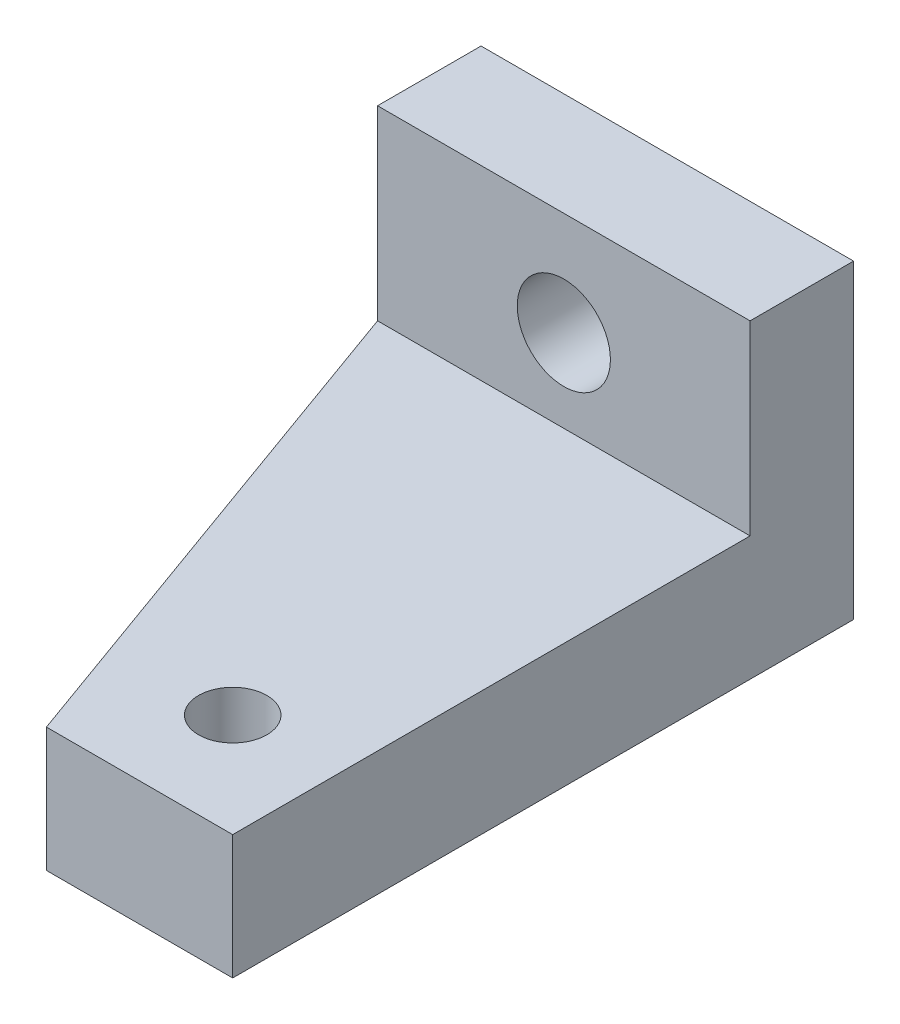
ISO-10303-21;
HEADER;
FILE_DESCRIPTION(('STEP AP214'),'2;1');
FILE_NAME('part.step','',(''),(''),'','','');
FILE_SCHEMA(('AUTOMOTIVE_DESIGN { 1 0 10303 214 1 1 1 1 }'));
ENDSEC;
DATA;
#1=APPLICATION_CONTEXT('core data for automotive mechanical design processes');
#2=APPLICATION_PROTOCOL_DEFINITION('international standard','automotive_design',2000,#1);
#3=PRODUCT_CONTEXT('',#1,'mechanical');
#4=PRODUCT('Part','Part','',(#3));
#5=PRODUCT_RELATED_PRODUCT_CATEGORY('part','',(#4));
#6=PRODUCT_DEFINITION_FORMATION('','',#4);
#7=PRODUCT_DEFINITION_CONTEXT('part definition',#1,'design');
#8=PRODUCT_DEFINITION('design','',#6,#7);
#9=PRODUCT_DEFINITION_SHAPE('','',#8);
#10=(LENGTH_UNIT() NAMED_UNIT(*) SI_UNIT(.MILLI.,.METRE.));
#11=(NAMED_UNIT(*) PLANE_ANGLE_UNIT() SI_UNIT($,.RADIAN.));
#12=(NAMED_UNIT(*) SI_UNIT($,.STERADIAN.) SOLID_ANGLE_UNIT());
#13=UNCERTAINTY_MEASURE_WITH_UNIT(LENGTH_MEASURE(1.E-05),#10,'distance_accuracy_value','');
#14=(GEOMETRIC_REPRESENTATION_CONTEXT(3) GLOBAL_UNCERTAINTY_ASSIGNED_CONTEXT((#13)) GLOBAL_UNIT_ASSIGNED_CONTEXT((#10,
#11,#12)) REPRESENTATION_CONTEXT('',''));
#15=CARTESIAN_POINT('',(0.,0.,0.));
#16=DIRECTION('',(0.,0.,1.));
#17=DIRECTION('',(1.,0.,0.));
#18=AXIS2_PLACEMENT_3D('',#15,#16,#17);
#19=CARTESIAN_POINT('',(9.00000000000001,0.,30.));
#20=DIRECTION('',(0.,1.,0.));
#21=DIRECTION('',(0.,0.,-1.));
#22=AXIS2_PLACEMENT_3D('',#19,#20,#21);
#23=PLANE('',#22);
#24=CARTESIAN_POINT('',(4.,0.,25.));
#25=DIRECTION('',(0.,1.,0.));
#26=DIRECTION('',(0.,0.,1.));
#27=AXIS2_PLACEMENT_3D('',#24,#25,#26);
#28=CIRCLE('',#27,1.64999999999999);
#29=CARTESIAN_POINT('',(4.,0.,26.65));
#30=VERTEX_POINT('',#29);
#31=EDGE_CURVE('E157',#30,#30,#28,.T.);
#32=ORIENTED_EDGE('',*,*,#31,.T.);
#33=EDGE_LOOP('',(#32));
#34=FACE_BOUND('',#33,.T.);
#35=DIRECTION('',(-0.338719468272742,0.,-0.940887411868728));
#36=VECTOR('',#35,1.);
#37=CARTESIAN_POINT('',(1.03257790368272,0.,32.8682719546742));
#38=LINE('',#37,#36);
#39=CARTESIAN_POINT('',(0.,0.,30.));
#40=VERTEX_POINT('',#39);
#41=CARTESIAN_POINT('',(-9.00000000000001,0.,4.99999999999999));
#42=VERTEX_POINT('',#41);
#43=EDGE_CURVE('E148',#40,#42,#38,.T.);
#44=ORIENTED_EDGE('',*,*,#43,.T.);
#45=DIRECTION('',(0.,0.,1.));
#46=VECTOR('',#45,1.);
#47=CARTESIAN_POINT('',(-9.00000000000001,0.,30.0000000000001));
#48=LINE('',#47,#46);
#49=CARTESIAN_POINT('',(-8.99999999999995,0.,0.));
#50=VERTEX_POINT('',#49);
#51=EDGE_CURVE('E129',#50,#42,#48,.T.);
#52=ORIENTED_EDGE('',*,*,#51,.F.);
#53=DIRECTION('',(-1.,0.,0.));
#54=VECTOR('',#53,1.);
#55=CARTESIAN_POINT('',(9.00000000000001,0.,0.));
#56=LINE('',#55,#54);
#57=CARTESIAN_POINT('',(9.00000000000001,0.,0.));
#58=VERTEX_POINT('',#57);
#59=EDGE_CURVE('E128',#58,#50,#56,.T.);
#60=ORIENTED_EDGE('',*,*,#59,.F.);
#61=DIRECTION('',(0.,0.,1.));
#62=VECTOR('',#61,1.);
#63=CARTESIAN_POINT('',(9.00000000000001,0.,30.));
#64=LINE('',#63,#62);
#65=CARTESIAN_POINT('',(9.00000000000001,0.,30.));
#66=VERTEX_POINT('',#65);
#67=EDGE_CURVE('E136',#58,#66,#64,.T.);
#68=ORIENTED_EDGE('',*,*,#67,.T.);
#69=DIRECTION('',(-1.,0.,0.));
#70=VECTOR('',#69,1.);
#71=CARTESIAN_POINT('',(9.00000000000001,0.,30.));
#72=LINE('',#71,#70);
#73=EDGE_CURVE('E52',#66,#40,#72,.T.);
#74=ORIENTED_EDGE('',*,*,#73,.T.);
#75=EDGE_LOOP('',(#44,#52,#60,#68,#74));
#76=FACE_BOUND('',#75,.T.);
#77=ADVANCED_FACE('F45',(#34,#76),#23,.F.);
#78=CARTESIAN_POINT('',(9.00000000000001,6.00000000000001,30.));
#79=DIRECTION('',(0.,0.,-1.));
#80=DIRECTION('',(1.,0.,0.));
#81=AXIS2_PLACEMENT_3D('',#78,#79,#80);
#82=PLANE('',#81);
#83=DIRECTION('',(0.,1.,0.));
#84=VECTOR('',#83,1.);
#85=CARTESIAN_POINT('',(0.,-47.5821657766857,30.));
#86=LINE('',#85,#84);
#87=CARTESIAN_POINT('',(0.,6.00000000000001,30.));
#88=VERTEX_POINT('',#87);
#89=EDGE_CURVE('E156',#40,#88,#86,.T.);
#90=ORIENTED_EDGE('',*,*,#89,.F.);
#91=ORIENTED_EDGE('',*,*,#73,.F.);
#92=DIRECTION('',(0.,1.,0.));
#93=VECTOR('',#92,1.);
#94=CARTESIAN_POINT('',(9.00000000000001,6.00000000000001,30.));
#95=LINE('',#94,#93);
#96=CARTESIAN_POINT('',(9.00000000000001,6.00000000000001,30.));
#97=VERTEX_POINT('',#96);
#98=EDGE_CURVE('E91',#66,#97,#95,.T.);
#99=ORIENTED_EDGE('',*,*,#98,.T.);
#100=DIRECTION('',(-1.,0.,0.));
#101=VECTOR('',#100,1.);
#102=CARTESIAN_POINT('',(9.00000000000001,6.00000000000001,30.));
#103=LINE('',#102,#101);
#104=EDGE_CURVE('E140',#97,#88,#103,.T.);
#105=ORIENTED_EDGE('',*,*,#104,.T.);
#106=EDGE_LOOP('',(#90,#91,#99,#105));
#107=FACE_BOUND('',#106,.T.);
#108=ADVANCED_FACE('F168',(#107),#82,.F.);
#109=CARTESIAN_POINT('',(9.00000000000001,6.00000000000001,5.00000000000002));
#110=DIRECTION('',(0.,-1.,0.));
#111=DIRECTION('',(0.,0.,1.));
#112=AXIS2_PLACEMENT_3D('',#109,#110,#111);
#113=PLANE('',#112);
#114=CARTESIAN_POINT('',(4.,6.00000000000001,25.));
#115=DIRECTION('',(0.,1.,0.));
#116=DIRECTION('',(0.,0.,1.));
#117=AXIS2_PLACEMENT_3D('',#114,#115,#116);
#118=CIRCLE('',#117,1.64999999999999);
#119=CARTESIAN_POINT('',(4.,6.00000000000001,26.65));
#120=VERTEX_POINT('',#119);
#121=EDGE_CURVE('E132',#120,#120,#118,.T.);
#122=ORIENTED_EDGE('',*,*,#121,.F.);
#123=EDGE_LOOP('',(#122));
#124=FACE_BOUND('',#123,.T.);
#125=DIRECTION('',(0.338719468272742,0.,0.940887411868728));
#126=VECTOR('',#125,1.);
#127=CARTESIAN_POINT('',(-6.93484419263451,6.00000000000001,10.7365439093484));
#128=LINE('',#127,#126);
#129=CARTESIAN_POINT('',(-9.00000000000001,6.00000000000001,4.99999999999999));
#130=VERTEX_POINT('',#129);
#131=EDGE_CURVE('E158',#130,#88,#128,.T.);
#132=ORIENTED_EDGE('',*,*,#131,.T.);
#133=ORIENTED_EDGE('',*,*,#104,.F.);
#134=DIRECTION('',(0.,0.,-1.));
#135=VECTOR('',#134,1.);
#136=CARTESIAN_POINT('',(9.00000000000001,6.00000000000001,5.00000000000002));
#137=LINE('',#136,#135);
#138=CARTESIAN_POINT('',(9.00000000000001,6.00000000000001,5.00000000000002));
#139=VERTEX_POINT('',#138);
#140=EDGE_CURVE('E122',#97,#139,#137,.T.);
#141=ORIENTED_EDGE('',*,*,#140,.T.);
#142=DIRECTION('',(-1.,0.,0.));
#143=VECTOR('',#142,1.);
#144=CARTESIAN_POINT('',(9.00000000000001,6.00000000000001,5.00000000000002));
#145=LINE('',#144,#143);
#146=EDGE_CURVE('E116',#139,#130,#145,.T.);
#147=ORIENTED_EDGE('',*,*,#146,.T.);
#148=EDGE_LOOP('',(#132,#133,#141,#147));
#149=FACE_BOUND('',#148,.T.);
#150=ADVANCED_FACE('F171',(#124,#149),#113,.F.);
#151=CARTESIAN_POINT('',(-8.99999999999995,0.,0.));
#152=DIRECTION('',(-1.,0.,0.));
#153=DIRECTION('',(0.,0.,-1.));
#154=AXIS2_PLACEMENT_3D('',#151,#152,#153);
#155=PLANE('',#154);
#156=DIRECTION('',(0.,1.,0.));
#157=VECTOR('',#156,1.);
#158=CARTESIAN_POINT('',(-9.00000000000001,15.,4.99999999999999));
#159=LINE('',#158,#157);
#160=CARTESIAN_POINT('',(-9.00000000000001,15.,4.99999999999999));
#161=VERTEX_POINT('',#160);
#162=EDGE_CURVE('E131',#130,#161,#159,.T.);
#163=ORIENTED_EDGE('',*,*,#162,.T.);
#164=DIRECTION('',(0.,0.,-1.));
#165=VECTOR('',#164,1.);
#166=CARTESIAN_POINT('',(-8.99999999999995,15.,0.));
#167=LINE('',#166,#165);
#168=CARTESIAN_POINT('',(-8.99999999999995,15.,0.));
#169=VERTEX_POINT('',#168);
#170=EDGE_CURVE('E112',#161,#169,#167,.T.);
#171=ORIENTED_EDGE('',*,*,#170,.T.);
#172=DIRECTION('',(0.,-1.,0.));
#173=VECTOR('',#172,1.);
#174=CARTESIAN_POINT('',(-8.99999999999995,0.,0.));
#175=LINE('',#174,#173);
#176=EDGE_CURVE('E84',#169,#50,#175,.T.);
#177=ORIENTED_EDGE('',*,*,#176,.T.);
#178=ORIENTED_EDGE('',*,*,#51,.T.);
#179=DIRECTION('',(0.,-1.,0.));
#180=VECTOR('',#179,1.);
#181=CARTESIAN_POINT('',(-9.00000000000001,0.,4.99999999999999));
#182=LINE('',#181,#180);
#183=EDGE_CURVE('E13',#130,#42,#182,.T.);
#184=ORIENTED_EDGE('',*,*,#183,.F.);
#185=EDGE_LOOP('',(#163,#171,#177,#178,#184));
#186=FACE_BOUND('',#185,.T.);
#187=ADVANCED_FACE('F172',(#186),#155,.T.);
#188=CARTESIAN_POINT('',(9.00000000000001,15.,5.00000000000002));
#189=DIRECTION('',(0.,0.,-1.));
#190=DIRECTION('',(0.,-1.,0.));
#191=AXIS2_PLACEMENT_3D('',#188,#189,#190);
#192=PLANE('',#191);
#193=CARTESIAN_POINT('',(0.,10.,5.));
#194=DIRECTION('',(0.,0.,-1.));
#195=DIRECTION('',(0.,1.,0.));
#196=AXIS2_PLACEMENT_3D('',#193,#194,#195);
#197=CIRCLE('',#196,2.24999999999999);
#198=CARTESIAN_POINT('',(0.,12.25,5.));
#199=VERTEX_POINT('',#198);
#200=EDGE_CURVE('E255',#199,#199,#197,.T.);
#201=ORIENTED_EDGE('',*,*,#200,.T.);
#202=EDGE_LOOP('',(#201));
#203=FACE_BOUND('',#202,.T.);
#204=ORIENTED_EDGE('',*,*,#162,.F.);
#205=ORIENTED_EDGE('',*,*,#146,.F.);
#206=DIRECTION('',(0.,1.,0.));
#207=VECTOR('',#206,1.);
#208=CARTESIAN_POINT('',(9.00000000000001,15.,5.00000000000002));
#209=LINE('',#208,#207);
#210=CARTESIAN_POINT('',(9.00000000000001,15.,5.00000000000002));
#211=VERTEX_POINT('',#210);
#212=EDGE_CURVE('E105',#139,#211,#209,.T.);
#213=ORIENTED_EDGE('',*,*,#212,.T.);
#214=DIRECTION('',(-1.,0.,0.));
#215=VECTOR('',#214,1.);
#216=CARTESIAN_POINT('',(9.00000000000001,15.,5.00000000000002));
#217=LINE('',#216,#215);
#218=EDGE_CURVE('E110',#211,#161,#217,.T.);
#219=ORIENTED_EDGE('',*,*,#218,.T.);
#220=EDGE_LOOP('',(#204,#205,#213,#219));
#221=FACE_BOUND('',#220,.T.);
#222=ADVANCED_FACE('F119',(#203,#221),#192,.F.);
#223=CARTESIAN_POINT('',(9.00000000000001,15.,0.));
#224=DIRECTION('',(0.,-1.,0.));
#225=DIRECTION('',(0.,0.,1.));
#226=AXIS2_PLACEMENT_3D('',#223,#224,#225);
#227=PLANE('',#226);
#228=ORIENTED_EDGE('',*,*,#170,.F.);
#229=ORIENTED_EDGE('',*,*,#218,.F.);
#230=DIRECTION('',(0.,0.,-1.));
#231=VECTOR('',#230,1.);
#232=CARTESIAN_POINT('',(9.00000000000001,15.,0.));
#233=LINE('',#232,#231);
#234=CARTESIAN_POINT('',(9.00000000000001,15.,0.));
#235=VERTEX_POINT('',#234);
#236=EDGE_CURVE('E101',#211,#235,#233,.T.);
#237=ORIENTED_EDGE('',*,*,#236,.T.);
#238=DIRECTION('',(-1.,0.,0.));
#239=VECTOR('',#238,1.);
#240=CARTESIAN_POINT('',(9.00000000000001,15.,0.));
#241=LINE('',#240,#239);
#242=EDGE_CURVE('E117',#235,#169,#241,.T.);
#243=ORIENTED_EDGE('',*,*,#242,.T.);
#244=EDGE_LOOP('',(#228,#229,#237,#243));
#245=FACE_BOUND('',#244,.T.);
#246=ADVANCED_FACE('F111',(#245),#227,.F.);
#247=CARTESIAN_POINT('',(9.00000000000001,0.,0.));
#248=DIRECTION('',(0.,0.,1.));
#249=DIRECTION('',(-1.,0.,0.));
#250=AXIS2_PLACEMENT_3D('',#247,#248,#249);
#251=PLANE('',#250);
#252=CARTESIAN_POINT('',(0.,10.,0.));
#253=DIRECTION('',(0.,0.,-1.));
#254=DIRECTION('',(-1.,0.,0.));
#255=AXIS2_PLACEMENT_3D('',#252,#253,#254);
#256=CIRCLE('',#255,2.24999999999999);
#257=CARTESIAN_POINT('',(-2.24999999999999,10.,0.));
#258=VERTEX_POINT('',#257);
#259=EDGE_CURVE('E252',#258,#258,#256,.T.);
#260=ORIENTED_EDGE('',*,*,#259,.F.);
#261=EDGE_LOOP('',(#260));
#262=FACE_BOUND('',#261,.T.);
#263=ORIENTED_EDGE('',*,*,#176,.F.);
#264=ORIENTED_EDGE('',*,*,#242,.F.);
#265=DIRECTION('',(0.,-1.,0.));
#266=VECTOR('',#265,1.);
#267=CARTESIAN_POINT('',(9.00000000000001,0.,0.));
#268=LINE('',#267,#266);
#269=EDGE_CURVE('E66',#235,#58,#268,.T.);
#270=ORIENTED_EDGE('',*,*,#269,.T.);
#271=ORIENTED_EDGE('',*,*,#59,.T.);
#272=EDGE_LOOP('',(#263,#264,#270,#271));
#273=FACE_BOUND('',#272,.T.);
#274=ADVANCED_FACE('F173',(#262,#273),#251,.F.);
#275=CARTESIAN_POINT('',(9.00000000000001,0.,0.));
#276=DIRECTION('',(-1.,0.,0.));
#277=DIRECTION('',(0.,0.,-1.));
#278=AXIS2_PLACEMENT_3D('',#275,#276,#277);
#279=PLANE('',#278);
#280=ORIENTED_EDGE('',*,*,#67,.F.);
#281=ORIENTED_EDGE('',*,*,#269,.F.);
#282=ORIENTED_EDGE('',*,*,#236,.F.);
#283=ORIENTED_EDGE('',*,*,#212,.F.);
#284=ORIENTED_EDGE('',*,*,#140,.F.);
#285=ORIENTED_EDGE('',*,*,#98,.F.);
#286=EDGE_LOOP('',(#280,#281,#282,#283,#284,#285));
#287=FACE_BOUND('',#286,.T.);
#288=ADVANCED_FACE('F103',(#287),#279,.F.);
#289=CARTESIAN_POINT('',(4.,0.,25.));
#290=DIRECTION('',(0.,-1.,0.));
#291=DIRECTION('',(0.,0.,1.));
#292=AXIS2_PLACEMENT_3D('',#289,#290,#291);
#293=CYLINDRICAL_SURFACE('',#292,1.64999999999999);
#294=ORIENTED_EDGE('',*,*,#121,.T.);
#295=EDGE_LOOP('',(#294));
#296=FACE_BOUND('',#295,.T.);
#297=ORIENTED_EDGE('',*,*,#31,.F.);
#298=EDGE_LOOP('',(#297));
#299=FACE_BOUND('',#298,.T.);
#300=ADVANCED_FACE('F181',(#296,#299),#293,.F.);
#301=CARTESIAN_POINT('',(0.,-47.5821657766857,30.));
#302=DIRECTION('',(-0.940887411868727,0.,0.338719468272742));
#303=DIRECTION('',(-0.338719468272742,0.,-0.940887411868728));
#304=AXIS2_PLACEMENT_3D('',#301,#302,#303);
#305=PLANE('',#304);
#306=ORIENTED_EDGE('',*,*,#89,.T.);
#307=ORIENTED_EDGE('',*,*,#131,.F.);
#308=ORIENTED_EDGE('',*,*,#183,.T.);
#309=ORIENTED_EDGE('',*,*,#43,.F.);
#310=EDGE_LOOP('',(#306,#307,#308,#309));
#311=FACE_BOUND('',#310,.T.);
#312=ADVANCED_FACE('F155',(#311),#305,.T.);
#313=CARTESIAN_POINT('',(0.,10.,5.));
#314=DIRECTION('',(0.,0.,1.));
#315=DIRECTION('',(0.,1.,0.));
#316=AXIS2_PLACEMENT_3D('',#313,#314,#315);
#317=CYLINDRICAL_SURFACE('',#316,2.24999999999999);
#318=ORIENTED_EDGE('',*,*,#259,.T.);
#319=EDGE_LOOP('',(#318));
#320=FACE_BOUND('',#319,.T.);
#321=ORIENTED_EDGE('',*,*,#200,.F.);
#322=EDGE_LOOP('',(#321));
#323=FACE_BOUND('',#322,.T.);
#324=ADVANCED_FACE('F199',(#320,#323),#317,.F.);
#325=CLOSED_SHELL('',(#77,#108,#150,#187,#222,#246,#274,#288,#300,#312,#324));
#326=MANIFOLD_SOLID_BREP('B2',#325);
#327=ADVANCED_BREP_SHAPE_REPRESENTATION('',(#18,#326),#14);
#328=SHAPE_DEFINITION_REPRESENTATION(#9,#327);
ENDSEC;
END-ISO-10303-21;
